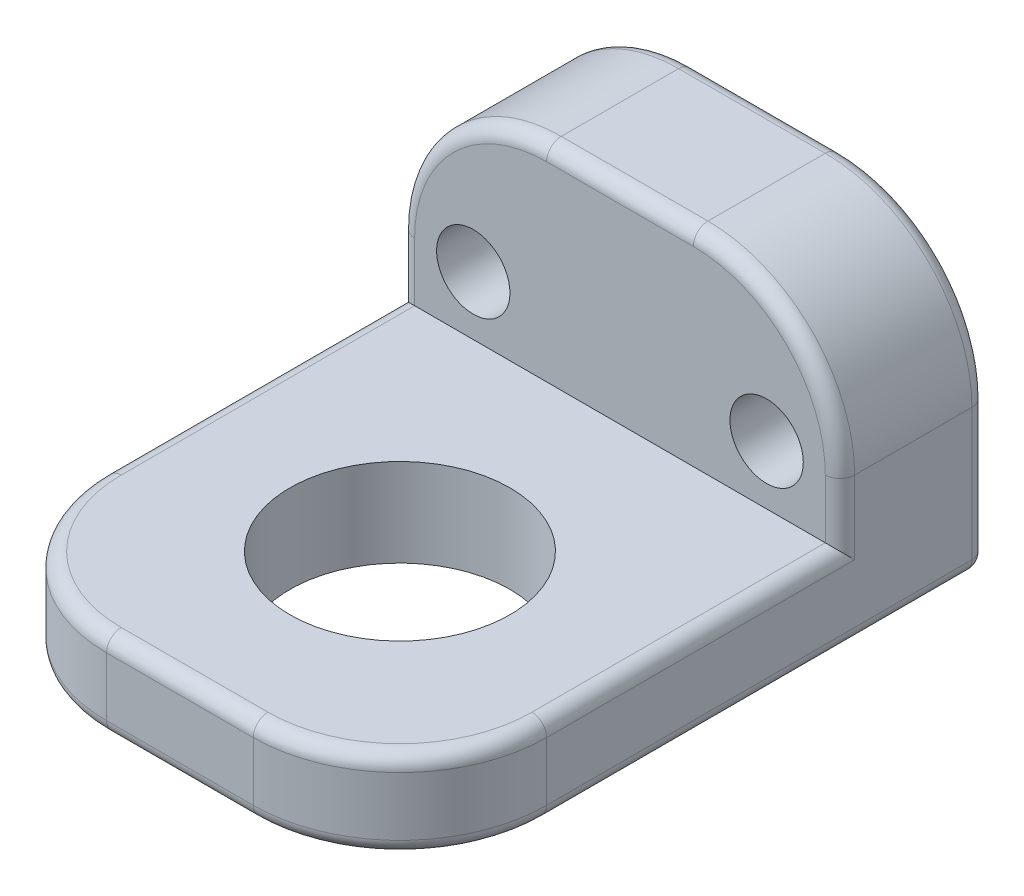
ISO-10303-21;
HEADER;
FILE_DESCRIPTION(('STEP AP214'),'2;1');
FILE_NAME('part.step','',(''),(''),'','','');
FILE_SCHEMA(('AUTOMOTIVE_DESIGN { 1 0 10303 214 1 1 1 1 }'));
ENDSEC;
DATA;
#1=APPLICATION_CONTEXT('core data for automotive mechanical design processes');
#2=APPLICATION_PROTOCOL_DEFINITION('international standard','automotive_design',2000,#1);
#3=PRODUCT_CONTEXT('',#1,'mechanical');
#4=PRODUCT('Part','Part','',(#3));
#5=PRODUCT_RELATED_PRODUCT_CATEGORY('part','',(#4));
#6=PRODUCT_DEFINITION_FORMATION('','',#4);
#7=PRODUCT_DEFINITION_CONTEXT('part definition',#1,'design');
#8=PRODUCT_DEFINITION('design','',#6,#7);
#9=PRODUCT_DEFINITION_SHAPE('','',#8);
#10=(LENGTH_UNIT() NAMED_UNIT(*) SI_UNIT(.MILLI.,.METRE.));
#11=(NAMED_UNIT(*) PLANE_ANGLE_UNIT() SI_UNIT($,.RADIAN.));
#12=(NAMED_UNIT(*) SI_UNIT($,.STERADIAN.) SOLID_ANGLE_UNIT());
#13=UNCERTAINTY_MEASURE_WITH_UNIT(LENGTH_MEASURE(1.E-05),#10,'distance_accuracy_value','');
#14=(GEOMETRIC_REPRESENTATION_CONTEXT(3) GLOBAL_UNCERTAINTY_ASSIGNED_CONTEXT((#13)) GLOBAL_UNIT_ASSIGNED_CONTEXT((#10,
#11,#12)) REPRESENTATION_CONTEXT('',''));
#15=CARTESIAN_POINT('',(0.,0.,0.));
#16=DIRECTION('',(0.,0.,1.));
#17=DIRECTION('',(1.,0.,0.));
#18=AXIS2_PLACEMENT_3D('',#15,#16,#17);
#19=CARTESIAN_POINT('',(15.,10.,10.));
#20=DIRECTION('',(-1.,0.,0.));
#21=DIRECTION('',(0.,-1.,0.));
#22=AXIS2_PLACEMENT_3D('',#19,#20,#21);
#23=PLANE('',#22);
#24=DIRECTION('',(0.,1.,0.));
#25=VECTOR('',#24,1.);
#26=CARTESIAN_POINT('',(15.,-4.,9.));
#27=LINE('',#26,#25);
#28=CARTESIAN_POINT('',(15.,0.,9.));
#29=VERTEX_POINT('',#28);
#30=CARTESIAN_POINT('',(15.,-5.,9.));
#31=VERTEX_POINT('',#30);
#32=EDGE_CURVE('E305',#29,#31,#27,.F.);
#33=ORIENTED_EDGE('',*,*,#32,.T.);
#34=DIRECTION('',(0.,0.,-1.));
#35=VECTOR('',#34,1.);
#36=CARTESIAN_POINT('',(15.,-5.,10.));
#37=LINE('',#36,#35);
#38=CARTESIAN_POINT('',(15.,-5.,30.));
#39=VERTEX_POINT('',#38);
#40=EDGE_CURVE('E307',#31,#39,#37,.F.);
#41=ORIENTED_EDGE('',*,*,#40,.T.);
#42=DIRECTION('',(0.,1.,0.));
#43=VECTOR('',#42,1.);
#44=CARTESIAN_POINT('',(15.,-10.,30.));
#45=LINE('',#44,#43);
#46=CARTESIAN_POINT('',(15.,-9.,30.));
#47=VERTEX_POINT('',#46);
#48=EDGE_CURVE('E376',#39,#47,#45,.F.);
#49=ORIENTED_EDGE('',*,*,#48,.T.);
#50=DIRECTION('',(0.,0.,-1.));
#51=VECTOR('',#50,1.);
#52=CARTESIAN_POINT('',(15.,-9.,10.));
#53=LINE('',#52,#51);
#54=CARTESIAN_POINT('',(15.,-9.,0.999999999999999));
#55=VERTEX_POINT('',#54);
#56=EDGE_CURVE('E204',#47,#55,#53,.T.);
#57=ORIENTED_EDGE('',*,*,#56,.T.);
#58=DIRECTION('',(0.,1.,0.));
#59=VECTOR('',#58,1.);
#60=CARTESIAN_POINT('',(15.,10.,0.999999999999999));
#61=LINE('',#60,#59);
#62=CARTESIAN_POINT('',(15.,0.,0.999999999999999));
#63=VERTEX_POINT('',#62);
#64=EDGE_CURVE('E180',#55,#63,#61,.T.);
#65=ORIENTED_EDGE('',*,*,#64,.T.);
#66=DIRECTION('',(0.,0.,-1.));
#67=VECTOR('',#66,1.);
#68=CARTESIAN_POINT('',(15.,0.,10.));
#69=LINE('',#68,#67);
#70=EDGE_CURVE('E201',#63,#29,#69,.F.);
#71=ORIENTED_EDGE('',*,*,#70,.T.);
#72=EDGE_LOOP('',(#33,#41,#49,#57,#65,#71));
#73=FACE_BOUND('',#72,.T.);
#74=ADVANCED_FACE('F33',(#73),#23,.F.);
#75=CARTESIAN_POINT('',(-15.,10.,10.));
#76=DIRECTION('',(0.,-1.,0.));
#77=DIRECTION('',(0.,0.,-1.));
#78=AXIS2_PLACEMENT_3D('',#75,#76,#77);
#79=PLANE('',#78);
#80=DIRECTION('',(0.,0.,-1.));
#81=VECTOR('',#80,1.);
#82=CARTESIAN_POINT('',(-5.,10.,10.));
#83=LINE('',#82,#81);
#84=CARTESIAN_POINT('',(-5.,10.,0.999999999999999));
#85=VERTEX_POINT('',#84);
#86=CARTESIAN_POINT('',(-5.,10.,9.));
#87=VERTEX_POINT('',#86);
#88=EDGE_CURVE('E215',#85,#87,#83,.F.);
#89=ORIENTED_EDGE('',*,*,#88,.T.);
#90=DIRECTION('',(-1.,0.,0.));
#91=VECTOR('',#90,1.);
#92=CARTESIAN_POINT('',(5.,10.,9.));
#93=LINE('',#92,#91);
#94=CARTESIAN_POINT('',(5.,10.,9.));
#95=VERTEX_POINT('',#94);
#96=EDGE_CURVE('E327',#87,#95,#93,.F.);
#97=ORIENTED_EDGE('',*,*,#96,.T.);
#98=DIRECTION('',(0.,0.,-1.));
#99=VECTOR('',#98,1.);
#100=CARTESIAN_POINT('',(5.,10.,10.));
#101=LINE('',#100,#99);
#102=CARTESIAN_POINT('',(5.,10.,0.999999999999999));
#103=VERTEX_POINT('',#102);
#104=EDGE_CURVE('E212',#95,#103,#101,.T.);
#105=ORIENTED_EDGE('',*,*,#104,.T.);
#106=DIRECTION('',(-1.,0.,0.));
#107=VECTOR('',#106,1.);
#108=CARTESIAN_POINT('',(-15.,10.,0.999999999999999));
#109=LINE('',#108,#107);
#110=EDGE_CURVE('E197',#103,#85,#109,.T.);
#111=ORIENTED_EDGE('',*,*,#110,.T.);
#112=EDGE_LOOP('',(#89,#97,#105,#111));
#113=FACE_BOUND('',#112,.T.);
#114=ADVANCED_FACE('F375',(#113),#79,.F.);
#115=CARTESIAN_POINT('',(-15.,10.,10.));
#116=DIRECTION('',(1.,0.,0.));
#117=DIRECTION('',(0.,1.,0.));
#118=AXIS2_PLACEMENT_3D('',#115,#116,#117);
#119=PLANE('',#118);
#120=DIRECTION('',(0.,0.,-1.));
#121=VECTOR('',#120,1.);
#122=CARTESIAN_POINT('',(-15.,-5.,10.));
#123=LINE('',#122,#121);
#124=CARTESIAN_POINT('',(-15.,-5.,30.));
#125=VERTEX_POINT('',#124);
#126=CARTESIAN_POINT('',(-15.,-5.,9.));
#127=VERTEX_POINT('',#126);
#128=EDGE_CURVE('E50',#125,#127,#123,.T.);
#129=ORIENTED_EDGE('',*,*,#128,.T.);
#130=DIRECTION('',(0.,-1.,0.));
#131=VECTOR('',#130,1.);
#132=CARTESIAN_POINT('',(-15.,0.,9.));
#133=LINE('',#132,#131);
#134=CARTESIAN_POINT('',(-15.,0.,9.));
#135=VERTEX_POINT('',#134);
#136=EDGE_CURVE('E42',#127,#135,#133,.F.);
#137=ORIENTED_EDGE('',*,*,#136,.T.);
#138=DIRECTION('',(0.,0.,-1.));
#139=VECTOR('',#138,1.);
#140=CARTESIAN_POINT('',(-15.,0.,10.));
#141=LINE('',#140,#139);
#142=CARTESIAN_POINT('',(-15.,0.,0.999999999999999));
#143=VERTEX_POINT('',#142);
#144=EDGE_CURVE('E211',#135,#143,#141,.T.);
#145=ORIENTED_EDGE('',*,*,#144,.T.);
#146=DIRECTION('',(0.,-1.,0.));
#147=VECTOR('',#146,1.);
#148=CARTESIAN_POINT('',(-15.,10.,0.999999999999999));
#149=LINE('',#148,#147);
#150=CARTESIAN_POINT('',(-15.,-9.,0.999999999999999));
#151=VERTEX_POINT('',#150);
#152=EDGE_CURVE('E257',#143,#151,#149,.T.);
#153=ORIENTED_EDGE('',*,*,#152,.T.);
#154=DIRECTION('',(0.,0.,-1.));
#155=VECTOR('',#154,1.);
#156=CARTESIAN_POINT('',(-15.,-9.,10.));
#157=LINE('',#156,#155);
#158=CARTESIAN_POINT('',(-15.,-9.,30.));
#159=VERTEX_POINT('',#158);
#160=EDGE_CURVE('E255',#151,#159,#157,.F.);
#161=ORIENTED_EDGE('',*,*,#160,.T.);
#162=DIRECTION('',(0.,-1.,0.));
#163=VECTOR('',#162,1.);
#164=CARTESIAN_POINT('',(-15.,-4.,30.));
#165=LINE('',#164,#163);
#166=EDGE_CURVE('E377',#159,#125,#165,.F.);
#167=ORIENTED_EDGE('',*,*,#166,.T.);
#168=EDGE_LOOP('',(#129,#137,#145,#153,#161,#167));
#169=FACE_BOUND('',#168,.T.);
#170=ADVANCED_FACE('F413',(#169),#119,.F.);
#171=CARTESIAN_POINT('',(-15.,-10.,10.));
#172=DIRECTION('',(0.,1.,0.));
#173=DIRECTION('',(0.,0.,1.));
#174=AXIS2_PLACEMENT_3D('',#171,#172,#173);
#175=PLANE('',#174);
#176=DIRECTION('',(1.,0.,0.));
#177=VECTOR('',#176,1.);
#178=CARTESIAN_POINT('',(-15.,-10.,0.999999999999999));
#179=LINE('',#178,#177);
#180=CARTESIAN_POINT('',(-14.,-10.,0.999999999999999));
#181=VERTEX_POINT('',#180);
#182=CARTESIAN_POINT('',(14.,-10.,0.999999999999999));
#183=VERTEX_POINT('',#182);
#184=EDGE_CURVE('E236',#181,#183,#179,.T.);
#185=ORIENTED_EDGE('',*,*,#184,.T.);
#186=DIRECTION('',(0.,0.,-1.));
#187=VECTOR('',#186,1.);
#188=CARTESIAN_POINT('',(14.,-10.,10.));
#189=LINE('',#188,#187);
#190=CARTESIAN_POINT('',(14.,-10.,30.));
#191=VERTEX_POINT('',#190);
#192=EDGE_CURVE('E244',#183,#191,#189,.F.);
#193=ORIENTED_EDGE('',*,*,#192,.T.);
#194=CARTESIAN_POINT('',(5.,-10.,30.));
#195=DIRECTION('',(0.,1.,0.));
#196=DIRECTION('',(0.,0.,1.));
#197=AXIS2_PLACEMENT_3D('',#194,#195,#196);
#198=CIRCLE('',#197,9.);
#199=CARTESIAN_POINT('',(5.,-10.,39.));
#200=VERTEX_POINT('',#199);
#201=EDGE_CURVE('E242',#191,#200,#198,.F.);
#202=ORIENTED_EDGE('',*,*,#201,.T.);
#203=DIRECTION('',(1.,0.,0.));
#204=VECTOR('',#203,1.);
#205=CARTESIAN_POINT('',(-5.,-10.,39.));
#206=LINE('',#205,#204);
#207=CARTESIAN_POINT('',(-5.,-10.,39.));
#208=VERTEX_POINT('',#207);
#209=EDGE_CURVE('E240',#200,#208,#206,.F.);
#210=ORIENTED_EDGE('',*,*,#209,.T.);
#211=CARTESIAN_POINT('',(-5.,-10.,30.));
#212=DIRECTION('',(0.,1.,0.));
#213=DIRECTION('',(0.,0.,1.));
#214=AXIS2_PLACEMENT_3D('',#211,#212,#213);
#215=CIRCLE('',#214,9.);
#216=CARTESIAN_POINT('',(-14.,-10.,30.));
#217=VERTEX_POINT('',#216);
#218=EDGE_CURVE('E238',#208,#217,#215,.F.);
#219=ORIENTED_EDGE('',*,*,#218,.T.);
#220=DIRECTION('',(0.,0.,-1.));
#221=VECTOR('',#220,1.);
#222=CARTESIAN_POINT('',(-14.,-10.,10.));
#223=LINE('',#222,#221);
#224=EDGE_CURVE('E234',#217,#181,#223,.T.);
#225=ORIENTED_EDGE('',*,*,#224,.T.);
#226=EDGE_LOOP('',(#185,#193,#202,#210,#219,#225));
#227=FACE_BOUND('',#226,.T.);
#228=CARTESIAN_POINT('',(0.,-10.,25.));
#229=DIRECTION('',(0.,-1.,0.));
#230=DIRECTION('',(0.,0.,-1.));
#231=AXIS2_PLACEMENT_3D('',#228,#229,#230);
#232=CIRCLE('',#231,7.5);
#233=CARTESIAN_POINT('',(0.,-10.,17.5));
#234=VERTEX_POINT('',#233);
#235=EDGE_CURVE('E294',#234,#234,#232,.T.);
#236=ORIENTED_EDGE('',*,*,#235,.F.);
#237=EDGE_LOOP('',(#236));
#238=FACE_BOUND('',#237,.T.);
#239=ADVANCED_FACE('F410',(#227,#238),#175,.F.);
#240=CARTESIAN_POINT('',(0.,0.,10.));
#241=DIRECTION('',(0.,0.,1.));
#242=DIRECTION('',(1.,0.,0.));
#243=AXIS2_PLACEMENT_3D('',#240,#241,#242);
#244=PLANE('',#243);
#245=DIRECTION('',(-1.,0.,0.));
#246=VECTOR('',#245,1.);
#247=CARTESIAN_POINT('',(15.,-4.,10.));
#248=LINE('',#247,#246);
#249=CARTESIAN_POINT('',(14.,-4.,10.));
#250=VERTEX_POINT('',#249);
#251=CARTESIAN_POINT('',(-14.,-4.,10.));
#252=VERTEX_POINT('',#251);
#253=EDGE_CURVE('E390',#250,#252,#248,.T.);
#254=ORIENTED_EDGE('',*,*,#253,.F.);
#255=DIRECTION('',(0.,1.,0.));
#256=VECTOR('',#255,1.);
#257=CARTESIAN_POINT('',(14.,0.,10.));
#258=LINE('',#257,#256);
#259=CARTESIAN_POINT('',(14.,0.,10.));
#260=VERTEX_POINT('',#259);
#261=EDGE_CURVE('E324',#250,#260,#258,.T.);
#262=ORIENTED_EDGE('',*,*,#261,.T.);
#263=CARTESIAN_POINT('',(5.,0.,10.));
#264=DIRECTION('',(0.,0.,1.));
#265=DIRECTION('',(1.,0.,0.));
#266=AXIS2_PLACEMENT_3D('',#263,#264,#265);
#267=CIRCLE('',#266,9.);
#268=CARTESIAN_POINT('',(5.,9.,10.));
#269=VERTEX_POINT('',#268);
#270=EDGE_CURVE('E322',#260,#269,#267,.T.);
#271=ORIENTED_EDGE('',*,*,#270,.T.);
#272=DIRECTION('',(-1.,0.,0.));
#273=VECTOR('',#272,1.);
#274=CARTESIAN_POINT('',(-5.,9.,10.));
#275=LINE('',#274,#273);
#276=CARTESIAN_POINT('',(-5.,9.,10.));
#277=VERTEX_POINT('',#276);
#278=EDGE_CURVE('E320',#269,#277,#275,.T.);
#279=ORIENTED_EDGE('',*,*,#278,.T.);
#280=CARTESIAN_POINT('',(-5.,0.,10.));
#281=DIRECTION('',(0.,0.,1.));
#282=DIRECTION('',(1.,0.,0.));
#283=AXIS2_PLACEMENT_3D('',#280,#281,#282);
#284=CIRCLE('',#283,9.);
#285=CARTESIAN_POINT('',(-14.,0.,10.));
#286=VERTEX_POINT('',#285);
#287=EDGE_CURVE('E316',#277,#286,#284,.T.);
#288=ORIENTED_EDGE('',*,*,#287,.T.);
#289=DIRECTION('',(0.,-1.,0.));
#290=VECTOR('',#289,1.);
#291=CARTESIAN_POINT('',(-14.,-4.,10.));
#292=LINE('',#291,#290);
#293=EDGE_CURVE('E318',#286,#252,#292,.T.);
#294=ORIENTED_EDGE('',*,*,#293,.T.);
#295=EDGE_LOOP('',(#254,#262,#271,#279,#288,#294));
#296=FACE_BOUND('',#295,.T.);
#297=CARTESIAN_POINT('',(-10.,0.,10.));
#298=DIRECTION('',(0.,0.,1.));
#299=DIRECTION('',(1.,0.,0.));
#300=AXIS2_PLACEMENT_3D('',#297,#298,#299);
#301=CIRCLE('',#300,2.5);
#302=CARTESIAN_POINT('',(-7.5,0.,10.));
#303=VERTEX_POINT('',#302);
#304=EDGE_CURVE('E397',#303,#303,#301,.T.);
#305=ORIENTED_EDGE('',*,*,#304,.F.);
#306=EDGE_LOOP('',(#305));
#307=FACE_BOUND('',#306,.T.);
#308=CARTESIAN_POINT('',(10.,0.,10.));
#309=DIRECTION('',(0.,0.,1.));
#310=DIRECTION('',(1.,0.,0.));
#311=AXIS2_PLACEMENT_3D('',#308,#309,#310);
#312=CIRCLE('',#311,2.5);
#313=CARTESIAN_POINT('',(12.5,0.,10.));
#314=VERTEX_POINT('',#313);
#315=EDGE_CURVE('E391',#314,#314,#312,.T.);
#316=ORIENTED_EDGE('',*,*,#315,.F.);
#317=EDGE_LOOP('',(#316));
#318=FACE_BOUND('',#317,.T.);
#319=ADVANCED_FACE('F412',(#296,#307,#318),#244,.T.);
#320=CARTESIAN_POINT('',(0.,0.,0.));
#321=DIRECTION('',(0.,0.,1.));
#322=DIRECTION('',(1.,0.,0.));
#323=AXIS2_PLACEMENT_3D('',#320,#321,#322);
#324=PLANE('',#323);
#325=CARTESIAN_POINT('',(5.,0.,0.));
#326=DIRECTION('',(0.,0.,1.));
#327=DIRECTION('',(1.,0.,0.));
#328=AXIS2_PLACEMENT_3D('',#325,#326,#327);
#329=CIRCLE('',#328,9.);
#330=CARTESIAN_POINT('',(5.,9.,0.));
#331=VERTEX_POINT('',#330);
#332=CARTESIAN_POINT('',(14.,0.,0.));
#333=VERTEX_POINT('',#332);
#334=EDGE_CURVE('E227',#331,#333,#329,.F.);
#335=ORIENTED_EDGE('',*,*,#334,.T.);
#336=DIRECTION('',(0.,1.,0.));
#337=VECTOR('',#336,1.);
#338=CARTESIAN_POINT('',(14.,0.,0.));
#339=LINE('',#338,#337);
#340=CARTESIAN_POINT('',(14.,-9.,0.));
#341=VERTEX_POINT('',#340);
#342=EDGE_CURVE('E182',#333,#341,#339,.F.);
#343=ORIENTED_EDGE('',*,*,#342,.T.);
#344=DIRECTION('',(1.,0.,0.));
#345=VECTOR('',#344,1.);
#346=CARTESIAN_POINT('',(0.,-9.,0.));
#347=LINE('',#346,#345);
#348=CARTESIAN_POINT('',(-14.,-9.,0.));
#349=VERTEX_POINT('',#348);
#350=EDGE_CURVE('E206',#341,#349,#347,.F.);
#351=ORIENTED_EDGE('',*,*,#350,.T.);
#352=DIRECTION('',(0.,-1.,0.));
#353=VECTOR('',#352,1.);
#354=CARTESIAN_POINT('',(-14.,0.,0.));
#355=LINE('',#354,#353);
#356=CARTESIAN_POINT('',(-14.,0.,0.));
#357=VERTEX_POINT('',#356);
#358=EDGE_CURVE('E221',#349,#357,#355,.F.);
#359=ORIENTED_EDGE('',*,*,#358,.T.);
#360=CARTESIAN_POINT('',(-5.,0.,0.));
#361=DIRECTION('',(0.,0.,1.));
#362=DIRECTION('',(1.,0.,0.));
#363=AXIS2_PLACEMENT_3D('',#360,#361,#362);
#364=CIRCLE('',#363,9.);
#365=CARTESIAN_POINT('',(-5.,9.,0.));
#366=VERTEX_POINT('',#365);
#367=EDGE_CURVE('E223',#357,#366,#364,.F.);
#368=ORIENTED_EDGE('',*,*,#367,.T.);
#369=DIRECTION('',(-1.,0.,0.));
#370=VECTOR('',#369,1.);
#371=CARTESIAN_POINT('',(0.,9.,0.));
#372=LINE('',#371,#370);
#373=EDGE_CURVE('E225',#366,#331,#372,.F.);
#374=ORIENTED_EDGE('',*,*,#373,.T.);
#375=EDGE_LOOP('',(#335,#343,#351,#359,#368,#374));
#376=FACE_BOUND('',#375,.T.);
#377=CARTESIAN_POINT('',(-10.,0.,0.));
#378=DIRECTION('',(0.,0.,1.));
#379=DIRECTION('',(1.,0.,0.));
#380=AXIS2_PLACEMENT_3D('',#377,#378,#379);
#381=CIRCLE('',#380,2.5);
#382=CARTESIAN_POINT('',(-7.5,0.,0.));
#383=VERTEX_POINT('',#382);
#384=EDGE_CURVE('E386',#383,#383,#381,.T.);
#385=ORIENTED_EDGE('',*,*,#384,.T.);
#386=EDGE_LOOP('',(#385));
#387=FACE_BOUND('',#386,.T.);
#388=CARTESIAN_POINT('',(10.,0.,0.));
#389=DIRECTION('',(0.,0.,1.));
#390=DIRECTION('',(1.,0.,0.));
#391=AXIS2_PLACEMENT_3D('',#388,#389,#390);
#392=CIRCLE('',#391,2.5);
#393=CARTESIAN_POINT('',(12.5,0.,0.));
#394=VERTEX_POINT('',#393);
#395=EDGE_CURVE('E394',#394,#394,#392,.T.);
#396=ORIENTED_EDGE('',*,*,#395,.T.);
#397=EDGE_LOOP('',(#396));
#398=FACE_BOUND('',#397,.T.);
#399=ADVANCED_FACE('F421',(#376,#387,#398),#324,.F.);
#400=CARTESIAN_POINT('',(10.,0.,0.));
#401=DIRECTION('',(0.,0.,1.));
#402=DIRECTION('',(1.,0.,0.));
#403=AXIS2_PLACEMENT_3D('',#400,#401,#402);
#404=CYLINDRICAL_SURFACE('',#403,2.5);
#405=ORIENTED_EDGE('',*,*,#395,.F.);
#406=EDGE_LOOP('',(#405));
#407=FACE_BOUND('',#406,.T.);
#408=ORIENTED_EDGE('',*,*,#315,.T.);
#409=EDGE_LOOP('',(#408));
#410=FACE_BOUND('',#409,.T.);
#411=ADVANCED_FACE('F647',(#407,#410),#404,.F.);
#412=CARTESIAN_POINT('',(-10.,0.,0.));
#413=DIRECTION('',(0.,0.,1.));
#414=DIRECTION('',(1.,0.,0.));
#415=AXIS2_PLACEMENT_3D('',#412,#413,#414);
#416=CYLINDRICAL_SURFACE('',#415,2.5);
#417=ORIENTED_EDGE('',*,*,#384,.F.);
#418=EDGE_LOOP('',(#417));
#419=FACE_BOUND('',#418,.T.);
#420=ORIENTED_EDGE('',*,*,#304,.T.);
#421=EDGE_LOOP('',(#420));
#422=FACE_BOUND('',#421,.T.);
#423=ADVANCED_FACE('F620',(#419,#422),#416,.F.);
#424=CARTESIAN_POINT('',(15.,-4.,40.));
#425=DIRECTION('',(0.,-1.,0.));
#426=DIRECTION('',(0.,0.,-1.));
#427=AXIS2_PLACEMENT_3D('',#424,#425,#426);
#428=PLANE('',#427);
#429=CARTESIAN_POINT('',(0.,-4.,25.));
#430=DIRECTION('',(0.,-1.,0.));
#431=DIRECTION('',(0.,0.,-1.));
#432=AXIS2_PLACEMENT_3D('',#429,#430,#431);
#433=CIRCLE('',#432,7.5);
#434=CARTESIAN_POINT('',(0.,-4.,17.5));
#435=VERTEX_POINT('',#434);
#436=EDGE_CURVE('E387',#435,#435,#433,.T.);
#437=ORIENTED_EDGE('',*,*,#436,.T.);
#438=EDGE_LOOP('',(#437));
#439=FACE_BOUND('',#438,.T.);
#440=CARTESIAN_POINT('',(5.,-4.,30.));
#441=DIRECTION('',(0.,-1.,0.));
#442=DIRECTION('',(0.,0.,-1.));
#443=AXIS2_PLACEMENT_3D('',#440,#441,#442);
#444=CIRCLE('',#443,9.);
#445=CARTESIAN_POINT('',(5.,-4.,39.));
#446=VERTEX_POINT('',#445);
#447=CARTESIAN_POINT('',(14.,-4.,30.));
#448=VERTEX_POINT('',#447);
#449=EDGE_CURVE('E300',#446,#448,#444,.F.);
#450=ORIENTED_EDGE('',*,*,#449,.T.);
#451=DIRECTION('',(0.,0.,-1.));
#452=VECTOR('',#451,1.);
#453=CARTESIAN_POINT('',(14.,-4.,40.));
#454=LINE('',#453,#452);
#455=EDGE_CURVE('E302',#448,#250,#454,.T.);
#456=ORIENTED_EDGE('',*,*,#455,.T.);
#457=ORIENTED_EDGE('',*,*,#253,.T.);
#458=DIRECTION('',(0.,0.,-1.));
#459=VECTOR('',#458,1.);
#460=CARTESIAN_POINT('',(-14.,-4.,40.));
#461=LINE('',#460,#459);
#462=CARTESIAN_POINT('',(-14.,-4.,30.));
#463=VERTEX_POINT('',#462);
#464=EDGE_CURVE('E258',#252,#463,#461,.F.);
#465=ORIENTED_EDGE('',*,*,#464,.T.);
#466=CARTESIAN_POINT('',(-5.,-4.,30.));
#467=DIRECTION('',(0.,-1.,0.));
#468=DIRECTION('',(0.,0.,-1.));
#469=AXIS2_PLACEMENT_3D('',#466,#467,#468);
#470=CIRCLE('',#469,9.);
#471=CARTESIAN_POINT('',(-5.,-4.,39.));
#472=VERTEX_POINT('',#471);
#473=EDGE_CURVE('E296',#463,#472,#470,.F.);
#474=ORIENTED_EDGE('',*,*,#473,.T.);
#475=DIRECTION('',(-1.,0.,0.));
#476=VECTOR('',#475,1.);
#477=CARTESIAN_POINT('',(5.,-4.,39.));
#478=LINE('',#477,#476);
#479=EDGE_CURVE('E298',#472,#446,#478,.F.);
#480=ORIENTED_EDGE('',*,*,#479,.T.);
#481=EDGE_LOOP('',(#450,#456,#457,#465,#474,#480));
#482=FACE_BOUND('',#481,.T.);
#483=ADVANCED_FACE('F611',(#439,#482),#428,.F.);
#484=CARTESIAN_POINT('',(0.,0.,40.));
#485=DIRECTION('',(0.,0.,1.));
#486=DIRECTION('',(1.,0.,0.));
#487=AXIS2_PLACEMENT_3D('',#484,#485,#486);
#488=PLANE('',#487);
#489=DIRECTION('',(0.,1.,0.));
#490=VECTOR('',#489,1.);
#491=CARTESIAN_POINT('',(5.,-4.,40.));
#492=LINE('',#491,#490);
#493=CARTESIAN_POINT('',(5.,-9.,40.));
#494=VERTEX_POINT('',#493);
#495=CARTESIAN_POINT('',(5.,-5.,40.));
#496=VERTEX_POINT('',#495);
#497=EDGE_CURVE('E383',#494,#496,#492,.T.);
#498=ORIENTED_EDGE('',*,*,#497,.T.);
#499=DIRECTION('',(-1.,0.,0.));
#500=VECTOR('',#499,1.);
#501=CARTESIAN_POINT('',(-5.,-5.,40.));
#502=LINE('',#501,#500);
#503=CARTESIAN_POINT('',(-5.,-5.,40.));
#504=VERTEX_POINT('',#503);
#505=EDGE_CURVE('E312',#496,#504,#502,.T.);
#506=ORIENTED_EDGE('',*,*,#505,.T.);
#507=DIRECTION('',(0.,-1.,0.));
#508=VECTOR('',#507,1.);
#509=CARTESIAN_POINT('',(-5.,-10.,40.));
#510=LINE('',#509,#508);
#511=CARTESIAN_POINT('',(-5.,-9.,40.));
#512=VERTEX_POINT('',#511);
#513=EDGE_CURVE('E381',#504,#512,#510,.T.);
#514=ORIENTED_EDGE('',*,*,#513,.T.);
#515=DIRECTION('',(1.,0.,0.));
#516=VECTOR('',#515,1.);
#517=CARTESIAN_POINT('',(5.,-9.,40.));
#518=LINE('',#517,#516);
#519=EDGE_CURVE('E250',#512,#494,#518,.T.);
#520=ORIENTED_EDGE('',*,*,#519,.T.);
#521=EDGE_LOOP('',(#498,#506,#514,#520));
#522=FACE_BOUND('',#521,.T.);
#523=ADVANCED_FACE('F603',(#522),#488,.T.);
#524=CARTESIAN_POINT('',(0.,20.,25.));
#525=DIRECTION('',(0.,-1.,0.));
#526=DIRECTION('',(0.,0.,-1.));
#527=AXIS2_PLACEMENT_3D('',#524,#525,#526);
#528=CYLINDRICAL_SURFACE('',#527,7.5);
#529=ORIENTED_EDGE('',*,*,#235,.T.);
#530=EDGE_LOOP('',(#529));
#531=FACE_BOUND('',#530,.T.);
#532=ORIENTED_EDGE('',*,*,#436,.F.);
#533=EDGE_LOOP('',(#532));
#534=FACE_BOUND('',#533,.T.);
#535=ADVANCED_FACE('F407',(#531,#534),#528,.F.);
#536=CARTESIAN_POINT('',(-5.,0.,30.));
#537=DIRECTION('',(0.,1.,0.));
#538=DIRECTION('',(-1.,0.,0.));
#539=AXIS2_PLACEMENT_3D('',#536,#537,#538);
#540=CYLINDRICAL_SURFACE('',#539,10.);
#541=ORIENTED_EDGE('',*,*,#513,.F.);
#542=CARTESIAN_POINT('',(-5.,-5.,30.));
#543=DIRECTION('',(0.,-1.,0.));
#544=DIRECTION('',(0.,0.,-1.));
#545=AXIS2_PLACEMENT_3D('',#542,#543,#544);
#546=CIRCLE('',#545,10.);
#547=EDGE_CURVE('E314',#504,#125,#546,.T.);
#548=ORIENTED_EDGE('',*,*,#547,.T.);
#549=ORIENTED_EDGE('',*,*,#166,.F.);
#550=CARTESIAN_POINT('',(-5.,-9.,30.));
#551=DIRECTION('',(0.,1.,0.));
#552=DIRECTION('',(0.,0.,1.));
#553=AXIS2_PLACEMENT_3D('',#550,#551,#552);
#554=CIRCLE('',#553,10.);
#555=EDGE_CURVE('E252',#159,#512,#554,.T.);
#556=ORIENTED_EDGE('',*,*,#555,.T.);
#557=EDGE_LOOP('',(#541,#548,#549,#556));
#558=FACE_BOUND('',#557,.T.);
#559=ADVANCED_FACE('F435',(#558),#540,.T.);
#560=CARTESIAN_POINT('',(5.,0.,30.));
#561=DIRECTION('',(0.,-1.,0.));
#562=DIRECTION('',(1.,0.,0.));
#563=AXIS2_PLACEMENT_3D('',#560,#561,#562);
#564=CYLINDRICAL_SURFACE('',#563,10.);
#565=ORIENTED_EDGE('',*,*,#48,.F.);
#566=CARTESIAN_POINT('',(5.,-5.,30.));
#567=DIRECTION('',(0.,-1.,0.));
#568=DIRECTION('',(0.,0.,-1.));
#569=AXIS2_PLACEMENT_3D('',#566,#567,#568);
#570=CIRCLE('',#569,10.);
#571=EDGE_CURVE('E310',#39,#496,#570,.T.);
#572=ORIENTED_EDGE('',*,*,#571,.T.);
#573=ORIENTED_EDGE('',*,*,#497,.F.);
#574=CARTESIAN_POINT('',(5.,-9.,30.));
#575=DIRECTION('',(0.,1.,0.));
#576=DIRECTION('',(0.,0.,1.));
#577=AXIS2_PLACEMENT_3D('',#574,#575,#576);
#578=CIRCLE('',#577,10.);
#579=EDGE_CURVE('E247',#494,#47,#578,.T.);
#580=ORIENTED_EDGE('',*,*,#579,.T.);
#581=EDGE_LOOP('',(#565,#572,#573,#580));
#582=FACE_BOUND('',#581,.T.);
#583=ADVANCED_FACE('F438',(#582),#564,.T.);
#584=CARTESIAN_POINT('',(5.,0.,10.));
#585=DIRECTION('',(0.,0.,-1.));
#586=DIRECTION('',(-1.,0.,0.));
#587=AXIS2_PLACEMENT_3D('',#584,#585,#586);
#588=CYLINDRICAL_SURFACE('',#587,10.);
#589=ORIENTED_EDGE('',*,*,#104,.F.);
#590=CARTESIAN_POINT('',(5.,0.,9.));
#591=DIRECTION('',(0.,0.,1.));
#592=DIRECTION('',(1.,0.,0.));
#593=AXIS2_PLACEMENT_3D('',#590,#591,#592);
#594=CIRCLE('',#593,10.);
#595=EDGE_CURVE('E210',#95,#29,#594,.F.);
#596=ORIENTED_EDGE('',*,*,#595,.T.);
#597=ORIENTED_EDGE('',*,*,#70,.F.);
#598=CARTESIAN_POINT('',(5.,0.,0.999999999999999));
#599=DIRECTION('',(0.,0.,1.));
#600=DIRECTION('',(1.,0.,0.));
#601=AXIS2_PLACEMENT_3D('',#598,#599,#600);
#602=CIRCLE('',#601,10.);
#603=EDGE_CURVE('E189',#63,#103,#602,.T.);
#604=ORIENTED_EDGE('',*,*,#603,.T.);
#605=EDGE_LOOP('',(#589,#596,#597,#604));
#606=FACE_BOUND('',#605,.T.);
#607=ADVANCED_FACE('F208',(#606),#588,.T.);
#608=CARTESIAN_POINT('',(-5.,0.,10.));
#609=DIRECTION('',(0.,0.,-1.));
#610=DIRECTION('',(-1.,0.,0.));
#611=AXIS2_PLACEMENT_3D('',#608,#609,#610);
#612=CYLINDRICAL_SURFACE('',#611,10.);
#613=ORIENTED_EDGE('',*,*,#144,.F.);
#614=CARTESIAN_POINT('',(-5.,0.,9.));
#615=DIRECTION('',(0.,0.,1.));
#616=DIRECTION('',(1.,0.,0.));
#617=AXIS2_PLACEMENT_3D('',#614,#615,#616);
#618=CIRCLE('',#617,10.);
#619=EDGE_CURVE('E11',#135,#87,#618,.F.);
#620=ORIENTED_EDGE('',*,*,#619,.T.);
#621=ORIENTED_EDGE('',*,*,#88,.F.);
#622=CARTESIAN_POINT('',(-5.,0.,0.999999999999999));
#623=DIRECTION('',(0.,0.,1.));
#624=DIRECTION('',(1.,0.,0.));
#625=AXIS2_PLACEMENT_3D('',#622,#623,#624);
#626=CIRCLE('',#625,10.);
#627=EDGE_CURVE('E231',#85,#143,#626,.T.);
#628=ORIENTED_EDGE('',*,*,#627,.T.);
#629=EDGE_LOOP('',(#613,#620,#621,#628));
#630=FACE_BOUND('',#629,.T.);
#631=ADVANCED_FACE('F372',(#630),#612,.T.);
#632=CARTESIAN_POINT('',(-5.,-9.,30.));
#633=DIRECTION('',(0.,1.,0.));
#634=DIRECTION('',(0.,0.,1.));
#635=AXIS2_PLACEMENT_3D('',#632,#633,#634);
#636=TOROIDAL_SURFACE('',#635,9.,1.);
#637=CARTESIAN_POINT('',(-5.,-9.,39.));
#638=DIRECTION('',(1.,0.,0.));
#639=DIRECTION('',(0.,0.,-1.));
#640=AXIS2_PLACEMENT_3D('',#637,#638,#639);
#641=CIRCLE('',#640,1.);
#642=EDGE_CURVE('E288',#512,#208,#641,.T.);
#643=ORIENTED_EDGE('',*,*,#642,.F.);
#644=ORIENTED_EDGE('',*,*,#555,.F.);
#645=CARTESIAN_POINT('',(-14.,-9.,30.));
#646=DIRECTION('',(0.,0.,-1.));
#647=DIRECTION('',(-1.,0.,0.));
#648=AXIS2_PLACEMENT_3D('',#645,#646,#647);
#649=CIRCLE('',#648,1.);
#650=EDGE_CURVE('E291',#217,#159,#649,.T.);
#651=ORIENTED_EDGE('',*,*,#650,.F.);
#652=ORIENTED_EDGE('',*,*,#218,.F.);
#653=EDGE_LOOP('',(#643,#644,#651,#652));
#654=FACE_BOUND('',#653,.T.);
#655=ADVANCED_FACE('F447',(#654),#636,.T.);
#656=CARTESIAN_POINT('',(-14.,-9.,10.));
#657=DIRECTION('',(0.,0.,-1.));
#658=DIRECTION('',(-1.,0.,0.));
#659=AXIS2_PLACEMENT_3D('',#656,#657,#658);
#660=CYLINDRICAL_SURFACE('',#659,1.);
#661=ORIENTED_EDGE('',*,*,#650,.T.);
#662=ORIENTED_EDGE('',*,*,#160,.F.);
#663=CARTESIAN_POINT('',(-14.,-9.,0.999999999999999));
#664=DIRECTION('',(0.,0.,-1.));
#665=DIRECTION('',(-1.,0.,0.));
#666=AXIS2_PLACEMENT_3D('',#663,#664,#665);
#667=CIRCLE('',#666,1.);
#668=EDGE_CURVE('E282',#181,#151,#667,.T.);
#669=ORIENTED_EDGE('',*,*,#668,.F.);
#670=ORIENTED_EDGE('',*,*,#224,.F.);
#671=EDGE_LOOP('',(#661,#662,#669,#670));
#672=FACE_BOUND('',#671,.T.);
#673=ADVANCED_FACE('F487',(#672),#660,.T.);
#674=CARTESIAN_POINT('',(0.,-9.,39.));
#675=DIRECTION('',(-1.,0.,0.));
#676=DIRECTION('',(0.,0.,1.));
#677=AXIS2_PLACEMENT_3D('',#674,#675,#676);
#678=CYLINDRICAL_SURFACE('',#677,1.);
#679=ORIENTED_EDGE('',*,*,#642,.T.);
#680=ORIENTED_EDGE('',*,*,#209,.F.);
#681=CARTESIAN_POINT('',(5.,-9.,39.));
#682=DIRECTION('',(1.,0.,0.));
#683=DIRECTION('',(0.,0.,-1.));
#684=AXIS2_PLACEMENT_3D('',#681,#682,#683);
#685=CIRCLE('',#684,1.);
#686=EDGE_CURVE('E279',#494,#200,#685,.T.);
#687=ORIENTED_EDGE('',*,*,#686,.F.);
#688=ORIENTED_EDGE('',*,*,#519,.F.);
#689=EDGE_LOOP('',(#679,#680,#687,#688));
#690=FACE_BOUND('',#689,.T.);
#691=ADVANCED_FACE('F483',(#690),#678,.T.);
#692=CARTESIAN_POINT('',(-14.,10.,0.999999999999999));
#693=DIRECTION('',(0.,-1.,0.));
#694=DIRECTION('',(1.,0.,0.));
#695=AXIS2_PLACEMENT_3D('',#692,#693,#694);
#696=CYLINDRICAL_SURFACE('',#695,1.);
#697=CARTESIAN_POINT('',(-14.,-9.,0.999999999999999));
#698=DIRECTION('',(0.,-1.,0.));
#699=DIRECTION('',(0.,0.,-1.));
#700=AXIS2_PLACEMENT_3D('',#697,#698,#699);
#701=CIRCLE('',#700,1.);
#702=EDGE_CURVE('E285',#151,#349,#701,.T.);
#703=ORIENTED_EDGE('',*,*,#702,.F.);
#704=ORIENTED_EDGE('',*,*,#152,.F.);
#705=CARTESIAN_POINT('',(-14.,0.,1.));
#706=DIRECTION('',(0.,1.,0.));
#707=DIRECTION('',(-1.,0.,0.));
#708=AXIS2_PLACEMENT_3D('',#705,#706,#707);
#709=CIRCLE('',#708,1.);
#710=EDGE_CURVE('E276',#357,#143,#709,.T.);
#711=ORIENTED_EDGE('',*,*,#710,.F.);
#712=ORIENTED_EDGE('',*,*,#358,.F.);
#713=EDGE_LOOP('',(#703,#704,#711,#712));
#714=FACE_BOUND('',#713,.T.);
#715=ADVANCED_FACE('F479',(#714),#696,.T.);
#716=CARTESIAN_POINT('',(-14.,-9.,1.));
#717=DIRECTION('',(0.,0.,1.));
#718=DIRECTION('',(1.,0.,0.));
#719=AXIS2_PLACEMENT_3D('',#716,#717,#718);
#720=SPHERICAL_SURFACE('',#719,1.);
#721=ORIENTED_EDGE('',*,*,#668,.T.);
#722=ORIENTED_EDGE('',*,*,#702,.T.);
#723=CARTESIAN_POINT('',(-14.,-9.,1.));
#724=DIRECTION('',(-1.,0.,0.));
#725=DIRECTION('',(0.,0.,1.));
#726=AXIS2_PLACEMENT_3D('',#723,#724,#725);
#727=CIRCLE('',#726,1.);
#728=EDGE_CURVE('E273',#181,#349,#727,.F.);
#729=ORIENTED_EDGE('',*,*,#728,.F.);
#730=EDGE_LOOP('',(#721,#722,#729));
#731=FACE_BOUND('',#730,.T.);
#732=ADVANCED_FACE('F475',(#731),#720,.T.);
#733=CARTESIAN_POINT('',(5.,-9.,30.));
#734=DIRECTION('',(0.,1.,0.));
#735=DIRECTION('',(0.,0.,1.));
#736=AXIS2_PLACEMENT_3D('',#733,#734,#735);
#737=TOROIDAL_SURFACE('',#736,9.,1.);
#738=ORIENTED_EDGE('',*,*,#686,.T.);
#739=ORIENTED_EDGE('',*,*,#201,.F.);
#740=CARTESIAN_POINT('',(14.,-9.,30.));
#741=DIRECTION('',(0.,0.,-1.));
#742=DIRECTION('',(-1.,0.,0.));
#743=AXIS2_PLACEMENT_3D('',#740,#741,#742);
#744=CIRCLE('',#743,1.);
#745=EDGE_CURVE('E271',#47,#191,#744,.T.);
#746=ORIENTED_EDGE('',*,*,#745,.F.);
#747=ORIENTED_EDGE('',*,*,#579,.F.);
#748=EDGE_LOOP('',(#738,#739,#746,#747));
#749=FACE_BOUND('',#748,.T.);
#750=ADVANCED_FACE('F471',(#749),#737,.T.);
#751=CARTESIAN_POINT('',(-5.,0.,0.999999999999999));
#752=DIRECTION('',(0.,0.,1.));
#753=DIRECTION('',(1.,0.,0.));
#754=AXIS2_PLACEMENT_3D('',#751,#752,#753);
#755=TOROIDAL_SURFACE('',#754,9.,1.);
#756=ORIENTED_EDGE('',*,*,#710,.T.);
#757=ORIENTED_EDGE('',*,*,#627,.F.);
#758=CARTESIAN_POINT('',(-5.,9.,1.));
#759=DIRECTION('',(1.,0.,0.));
#760=DIRECTION('',(0.,0.,-1.));
#761=AXIS2_PLACEMENT_3D('',#758,#759,#760);
#762=CIRCLE('',#761,1.);
#763=EDGE_CURVE('E268',#366,#85,#762,.T.);
#764=ORIENTED_EDGE('',*,*,#763,.F.);
#765=ORIENTED_EDGE('',*,*,#367,.F.);
#766=EDGE_LOOP('',(#756,#757,#764,#765));
#767=FACE_BOUND('',#766,.T.);
#768=ADVANCED_FACE('F467',(#767),#755,.T.);
#769=CARTESIAN_POINT('',(-15.,-9.,0.999999999999999));
#770=DIRECTION('',(1.,0.,0.));
#771=DIRECTION('',(0.,0.,-1.));
#772=AXIS2_PLACEMENT_3D('',#769,#770,#771);
#773=CYLINDRICAL_SURFACE('',#772,1.);
#774=ORIENTED_EDGE('',*,*,#728,.T.);
#775=ORIENTED_EDGE('',*,*,#350,.F.);
#776=CARTESIAN_POINT('',(14.,-9.,0.999999999999999));
#777=DIRECTION('',(1.,0.,0.));
#778=DIRECTION('',(0.,0.,-1.));
#779=AXIS2_PLACEMENT_3D('',#776,#777,#778);
#780=CIRCLE('',#779,1.);
#781=EDGE_CURVE('E265',#183,#341,#780,.T.);
#782=ORIENTED_EDGE('',*,*,#781,.F.);
#783=ORIENTED_EDGE('',*,*,#184,.F.);
#784=EDGE_LOOP('',(#774,#775,#782,#783));
#785=FACE_BOUND('',#784,.T.);
#786=ADVANCED_FACE('F463',(#785),#773,.T.);
#787=CARTESIAN_POINT('',(14.,-9.,10.));
#788=DIRECTION('',(0.,0.,-1.));
#789=DIRECTION('',(-1.,0.,0.));
#790=AXIS2_PLACEMENT_3D('',#787,#788,#789);
#791=CYLINDRICAL_SURFACE('',#790,1.);
#792=ORIENTED_EDGE('',*,*,#745,.T.);
#793=ORIENTED_EDGE('',*,*,#192,.F.);
#794=CARTESIAN_POINT('',(14.,-9.,0.999999999999999));
#795=DIRECTION('',(0.,0.,-1.));
#796=DIRECTION('',(-1.,0.,0.));
#797=AXIS2_PLACEMENT_3D('',#794,#795,#796);
#798=CIRCLE('',#797,1.);
#799=EDGE_CURVE('E262',#55,#183,#798,.T.);
#800=ORIENTED_EDGE('',*,*,#799,.F.);
#801=ORIENTED_EDGE('',*,*,#56,.F.);
#802=EDGE_LOOP('',(#792,#793,#800,#801));
#803=FACE_BOUND('',#802,.T.);
#804=ADVANCED_FACE('F459',(#803),#791,.T.);
#805=CARTESIAN_POINT('',(-15.,9.,0.999999999999999));
#806=DIRECTION('',(-1.,0.,0.));
#807=DIRECTION('',(0.,0.,1.));
#808=AXIS2_PLACEMENT_3D('',#805,#806,#807);
#809=CYLINDRICAL_SURFACE('',#808,1.);
#810=ORIENTED_EDGE('',*,*,#763,.T.);
#811=ORIENTED_EDGE('',*,*,#110,.F.);
#812=CARTESIAN_POINT('',(5.,9.,1.));
#813=DIRECTION('',(1.,0.,0.));
#814=DIRECTION('',(0.,0.,-1.));
#815=AXIS2_PLACEMENT_3D('',#812,#813,#814);
#816=CIRCLE('',#815,1.);
#817=EDGE_CURVE('E192',#331,#103,#816,.T.);
#818=ORIENTED_EDGE('',*,*,#817,.F.);
#819=ORIENTED_EDGE('',*,*,#373,.F.);
#820=EDGE_LOOP('',(#810,#811,#818,#819));
#821=FACE_BOUND('',#820,.T.);
#822=ADVANCED_FACE('F455',(#821),#809,.T.);
#823=CARTESIAN_POINT('',(14.,-9.,1.));
#824=DIRECTION('',(0.,0.,1.));
#825=DIRECTION('',(1.,0.,0.));
#826=AXIS2_PLACEMENT_3D('',#823,#824,#825);
#827=SPHERICAL_SURFACE('',#826,1.);
#828=ORIENTED_EDGE('',*,*,#799,.T.);
#829=ORIENTED_EDGE('',*,*,#781,.T.);
#830=CARTESIAN_POINT('',(14.,-9.,1.));
#831=DIRECTION('',(0.,-1.,0.));
#832=DIRECTION('',(0.,0.,-1.));
#833=AXIS2_PLACEMENT_3D('',#830,#831,#832);
#834=CIRCLE('',#833,1.);
#835=EDGE_CURVE('E185',#55,#341,#834,.F.);
#836=ORIENTED_EDGE('',*,*,#835,.F.);
#837=EDGE_LOOP('',(#828,#829,#836));
#838=FACE_BOUND('',#837,.T.);
#839=ADVANCED_FACE('F452',(#838),#827,.T.);
#840=CARTESIAN_POINT('',(5.,0.,0.999999999999999));
#841=DIRECTION('',(0.,0.,1.));
#842=DIRECTION('',(1.,0.,0.));
#843=AXIS2_PLACEMENT_3D('',#840,#841,#842);
#844=TOROIDAL_SURFACE('',#843,9.,1.);
#845=ORIENTED_EDGE('',*,*,#817,.T.);
#846=ORIENTED_EDGE('',*,*,#603,.F.);
#847=CARTESIAN_POINT('',(14.,0.,1.));
#848=DIRECTION('',(0.,-1.,0.));
#849=DIRECTION('',(1.,0.,0.));
#850=AXIS2_PLACEMENT_3D('',#847,#848,#849);
#851=CIRCLE('',#850,1.);
#852=EDGE_CURVE('E176',#333,#63,#851,.T.);
#853=ORIENTED_EDGE('',*,*,#852,.F.);
#854=ORIENTED_EDGE('',*,*,#334,.F.);
#855=EDGE_LOOP('',(#845,#846,#853,#854));
#856=FACE_BOUND('',#855,.T.);
#857=ADVANCED_FACE('F190',(#856),#844,.T.);
#858=CARTESIAN_POINT('',(14.,10.,0.999999999999999));
#859=DIRECTION('',(0.,1.,0.));
#860=DIRECTION('',(-1.,0.,0.));
#861=AXIS2_PLACEMENT_3D('',#858,#859,#860);
#862=CYLINDRICAL_SURFACE('',#861,1.);
#863=ORIENTED_EDGE('',*,*,#835,.T.);
#864=ORIENTED_EDGE('',*,*,#342,.F.);
#865=ORIENTED_EDGE('',*,*,#852,.T.);
#866=ORIENTED_EDGE('',*,*,#64,.F.);
#867=EDGE_LOOP('',(#863,#864,#865,#866));
#868=FACE_BOUND('',#867,.T.);
#869=ADVANCED_FACE('F178',(#868),#862,.T.);
#870=CARTESIAN_POINT('',(-14.,0.,9.));
#871=DIRECTION('',(0.,1.,0.));
#872=DIRECTION('',(-1.,0.,0.));
#873=AXIS2_PLACEMENT_3D('',#870,#871,#872);
#874=CYLINDRICAL_SURFACE('',#873,1.);
#875=CARTESIAN_POINT('',(-14.,0.,9.));
#876=DIRECTION('',(0.,1.,0.));
#877=DIRECTION('',(-1.,0.,0.));
#878=AXIS2_PLACEMENT_3D('',#875,#876,#877);
#879=CIRCLE('',#878,1.);
#880=EDGE_CURVE('E352',#135,#286,#879,.T.);
#881=ORIENTED_EDGE('',*,*,#880,.F.);
#882=ORIENTED_EDGE('',*,*,#136,.F.);
#883=CARTESIAN_POINT('',(-14.,-5.,9.));
#884=DIRECTION('',(0.,0.707106781186547,-0.707106781186547));
#885=DIRECTION('',(0.,0.707106781186547,0.707106781186547));
#886=AXIS2_PLACEMENT_3D('',#883,#884,#885);
#887=ELLIPSE('',#886,1.41421356237309,1.);
#888=EDGE_CURVE('E37',#252,#127,#887,.F.);
#889=ORIENTED_EDGE('',*,*,#888,.F.);
#890=ORIENTED_EDGE('',*,*,#293,.F.);
#891=EDGE_LOOP('',(#881,#882,#889,#890));
#892=FACE_BOUND('',#891,.T.);
#893=ADVANCED_FACE('F35',(#892),#874,.T.);
#894=CARTESIAN_POINT('',(-14.,-5.,10.));
#895=DIRECTION('',(0.,0.,-1.));
#896=DIRECTION('',(-1.,0.,0.));
#897=AXIS2_PLACEMENT_3D('',#894,#895,#896);
#898=CYLINDRICAL_SURFACE('',#897,1.);
#899=ORIENTED_EDGE('',*,*,#888,.T.);
#900=ORIENTED_EDGE('',*,*,#128,.F.);
#901=CARTESIAN_POINT('',(-14.,-5.,30.));
#902=DIRECTION('',(0.,0.,1.));
#903=DIRECTION('',(1.,0.,0.));
#904=AXIS2_PLACEMENT_3D('',#901,#902,#903);
#905=CIRCLE('',#904,1.);
#906=EDGE_CURVE('E350',#463,#125,#905,.T.);
#907=ORIENTED_EDGE('',*,*,#906,.F.);
#908=ORIENTED_EDGE('',*,*,#464,.F.);
#909=EDGE_LOOP('',(#899,#900,#907,#908));
#910=FACE_BOUND('',#909,.T.);
#911=ADVANCED_FACE('F362',(#910),#898,.T.);
#912=CARTESIAN_POINT('',(-5.,0.,9.));
#913=DIRECTION('',(0.,0.,1.));
#914=DIRECTION('',(1.,0.,0.));
#915=AXIS2_PLACEMENT_3D('',#912,#913,#914);
#916=TOROIDAL_SURFACE('',#915,9.,1.);
#917=ORIENTED_EDGE('',*,*,#880,.T.);
#918=ORIENTED_EDGE('',*,*,#287,.F.);
#919=CARTESIAN_POINT('',(-5.,9.,9.));
#920=DIRECTION('',(1.,0.,0.));
#921=DIRECTION('',(0.,0.,-1.));
#922=AXIS2_PLACEMENT_3D('',#919,#920,#921);
#923=CIRCLE('',#922,1.);
#924=EDGE_CURVE('E347',#87,#277,#923,.T.);
#925=ORIENTED_EDGE('',*,*,#924,.F.);
#926=ORIENTED_EDGE('',*,*,#619,.F.);
#927=EDGE_LOOP('',(#917,#918,#925,#926));
#928=FACE_BOUND('',#927,.T.);
#929=ADVANCED_FACE('F367',(#928),#916,.T.);
#930=CARTESIAN_POINT('',(-5.,-5.,30.));
#931=DIRECTION('',(0.,-1.,0.));
#932=DIRECTION('',(0.,0.,-1.));
#933=AXIS2_PLACEMENT_3D('',#930,#931,#932);
#934=TOROIDAL_SURFACE('',#933,9.,1.);
#935=ORIENTED_EDGE('',*,*,#906,.T.);
#936=ORIENTED_EDGE('',*,*,#547,.F.);
#937=CARTESIAN_POINT('',(-5.,-5.,39.));
#938=DIRECTION('',(1.,0.,0.));
#939=DIRECTION('',(0.,0.,-1.));
#940=AXIS2_PLACEMENT_3D('',#937,#938,#939);
#941=CIRCLE('',#940,1.);
#942=EDGE_CURVE('E344',#472,#504,#941,.T.);
#943=ORIENTED_EDGE('',*,*,#942,.F.);
#944=ORIENTED_EDGE('',*,*,#473,.F.);
#945=EDGE_LOOP('',(#935,#936,#943,#944));
#946=FACE_BOUND('',#945,.T.);
#947=ADVANCED_FACE('F518',(#946),#934,.T.);
#948=CARTESIAN_POINT('',(0.,9.,9.));
#949=DIRECTION('',(1.,0.,0.));
#950=DIRECTION('',(0.,0.,-1.));
#951=AXIS2_PLACEMENT_3D('',#948,#949,#950);
#952=CYLINDRICAL_SURFACE('',#951,1.);
#953=ORIENTED_EDGE('',*,*,#924,.T.);
#954=ORIENTED_EDGE('',*,*,#278,.F.);
#955=CARTESIAN_POINT('',(5.,9.,9.));
#956=DIRECTION('',(1.,0.,0.));
#957=DIRECTION('',(0.,0.,-1.));
#958=AXIS2_PLACEMENT_3D('',#955,#956,#957);
#959=CIRCLE('',#958,1.);
#960=EDGE_CURVE('E341',#95,#269,#959,.T.);
#961=ORIENTED_EDGE('',*,*,#960,.F.);
#962=ORIENTED_EDGE('',*,*,#96,.F.);
#963=EDGE_LOOP('',(#953,#954,#961,#962));
#964=FACE_BOUND('',#963,.T.);
#965=ADVANCED_FACE('F514',(#964),#952,.T.);
#966=CARTESIAN_POINT('',(0.,-5.,39.));
#967=DIRECTION('',(1.,0.,0.));
#968=DIRECTION('',(0.,0.,-1.));
#969=AXIS2_PLACEMENT_3D('',#966,#967,#968);
#970=CYLINDRICAL_SURFACE('',#969,1.);
#971=ORIENTED_EDGE('',*,*,#942,.T.);
#972=ORIENTED_EDGE('',*,*,#505,.F.);
#973=CARTESIAN_POINT('',(5.,-5.,39.));
#974=DIRECTION('',(1.,0.,0.));
#975=DIRECTION('',(0.,0.,-1.));
#976=AXIS2_PLACEMENT_3D('',#973,#974,#975);
#977=CIRCLE('',#976,1.);
#978=EDGE_CURVE('E338',#446,#496,#977,.T.);
#979=ORIENTED_EDGE('',*,*,#978,.F.);
#980=ORIENTED_EDGE('',*,*,#479,.F.);
#981=EDGE_LOOP('',(#971,#972,#979,#980));
#982=FACE_BOUND('',#981,.T.);
#983=ADVANCED_FACE('F510',(#982),#970,.T.);
#984=CARTESIAN_POINT('',(5.,0.,9.));
#985=DIRECTION('',(0.,0.,1.));
#986=DIRECTION('',(1.,0.,0.));
#987=AXIS2_PLACEMENT_3D('',#984,#985,#986);
#988=TOROIDAL_SURFACE('',#987,9.,1.);
#989=ORIENTED_EDGE('',*,*,#960,.T.);
#990=ORIENTED_EDGE('',*,*,#270,.F.);
#991=CARTESIAN_POINT('',(14.,0.,9.));
#992=DIRECTION('',(0.,-1.,0.));
#993=DIRECTION('',(1.,0.,0.));
#994=AXIS2_PLACEMENT_3D('',#991,#992,#993);
#995=CIRCLE('',#994,1.);
#996=EDGE_CURVE('E335',#29,#260,#995,.T.);
#997=ORIENTED_EDGE('',*,*,#996,.F.);
#998=ORIENTED_EDGE('',*,*,#595,.F.);
#999=EDGE_LOOP('',(#989,#990,#997,#998));
#1000=FACE_BOUND('',#999,.T.);
#1001=ADVANCED_FACE('F506',(#1000),#988,.T.);
#1002=CARTESIAN_POINT('',(5.,-5.,30.));
#1003=DIRECTION('',(0.,-1.,0.));
#1004=DIRECTION('',(0.,0.,-1.));
#1005=AXIS2_PLACEMENT_3D('',#1002,#1003,#1004);
#1006=TOROIDAL_SURFACE('',#1005,9.,1.);
#1007=ORIENTED_EDGE('',*,*,#978,.T.);
#1008=ORIENTED_EDGE('',*,*,#571,.F.);
#1009=CARTESIAN_POINT('',(14.,-5.,30.));
#1010=DIRECTION('',(0.,0.,-1.));
#1011=DIRECTION('',(-1.,0.,0.));
#1012=AXIS2_PLACEMENT_3D('',#1009,#1010,#1011);
#1013=CIRCLE('',#1012,1.);
#1014=EDGE_CURVE('E333',#448,#39,#1013,.T.);
#1015=ORIENTED_EDGE('',*,*,#1014,.F.);
#1016=ORIENTED_EDGE('',*,*,#449,.F.);
#1017=EDGE_LOOP('',(#1007,#1008,#1015,#1016));
#1018=FACE_BOUND('',#1017,.T.);
#1019=ADVANCED_FACE('F502',(#1018),#1006,.T.);
#1020=CARTESIAN_POINT('',(14.,0.,9.));
#1021=DIRECTION('',(0.,-1.,0.));
#1022=DIRECTION('',(1.,0.,0.));
#1023=AXIS2_PLACEMENT_3D('',#1020,#1021,#1022);
#1024=CYLINDRICAL_SURFACE('',#1023,1.);
#1025=ORIENTED_EDGE('',*,*,#996,.T.);
#1026=ORIENTED_EDGE('',*,*,#261,.F.);
#1027=CARTESIAN_POINT('',(14.,-5.,9.));
#1028=DIRECTION('',(0.,0.707106781186547,-0.707106781186547));
#1029=DIRECTION('',(0.,-0.707106781186547,-0.707106781186547));
#1030=AXIS2_PLACEMENT_3D('',#1027,#1028,#1029);
#1031=ELLIPSE('',#1030,1.41421356237309,1.);
#1032=EDGE_CURVE('E331',#31,#250,#1031,.F.);
#1033=ORIENTED_EDGE('',*,*,#1032,.F.);
#1034=ORIENTED_EDGE('',*,*,#32,.F.);
#1035=EDGE_LOOP('',(#1025,#1026,#1033,#1034));
#1036=FACE_BOUND('',#1035,.T.);
#1037=ADVANCED_FACE('F498',(#1036),#1024,.T.);
#1038=CARTESIAN_POINT('',(14.,-5.,40.));
#1039=DIRECTION('',(0.,0.,-1.));
#1040=DIRECTION('',(-1.,0.,0.));
#1041=AXIS2_PLACEMENT_3D('',#1038,#1039,#1040);
#1042=CYLINDRICAL_SURFACE('',#1041,1.);
#1043=ORIENTED_EDGE('',*,*,#1014,.T.);
#1044=ORIENTED_EDGE('',*,*,#40,.F.);
#1045=ORIENTED_EDGE('',*,*,#1032,.T.);
#1046=ORIENTED_EDGE('',*,*,#455,.F.);
#1047=EDGE_LOOP('',(#1043,#1044,#1045,#1046));
#1048=FACE_BOUND('',#1047,.T.);
#1049=ADVANCED_FACE('F495',(#1048),#1042,.T.);
#1050=CLOSED_SHELL('',(#74,#114,#170,#239,#319,#399,#411,#423,#483,#523,#535,#559,#583,#607,
#631,#655,#673,#691,#715,#732,#750,#768,#786,#804,#822,#839,#857,#869,#893,#911,#929,#947,#965,
#983,#1001,#1019,#1037,#1049));
#1051=MANIFOLD_SOLID_BREP('B2',#1050);
#1052=ADVANCED_BREP_SHAPE_REPRESENTATION('',(#18,#1051),#14);
#1053=SHAPE_DEFINITION_REPRESENTATION(#9,#1052);
ENDSEC;
END-ISO-10303-21;
